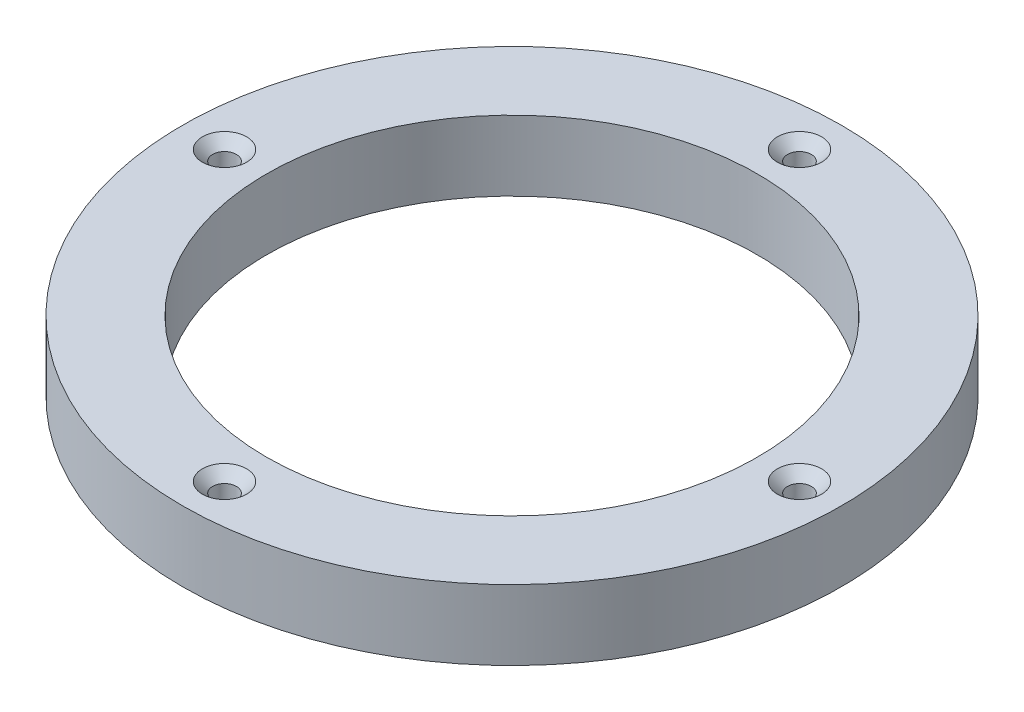
ISO-10303-21;
HEADER;
FILE_DESCRIPTION(('STEP AP214'),'2;1');
FILE_NAME('part.step','',(''),(''),'','','');
FILE_SCHEMA(('AUTOMOTIVE_DESIGN { 1 0 10303 214 1 1 1 1 }'));
ENDSEC;
DATA;
#1=APPLICATION_CONTEXT('core data for automotive mechanical design processes');
#2=APPLICATION_PROTOCOL_DEFINITION('international standard','automotive_design',2000,#1);
#3=PRODUCT_CONTEXT('',#1,'mechanical');
#4=PRODUCT('Part','Part','',(#3));
#5=PRODUCT_RELATED_PRODUCT_CATEGORY('part','',(#4));
#6=PRODUCT_DEFINITION_FORMATION('','',#4);
#7=PRODUCT_DEFINITION_CONTEXT('part definition',#1,'design');
#8=PRODUCT_DEFINITION('design','',#6,#7);
#9=PRODUCT_DEFINITION_SHAPE('','',#8);
#10=(LENGTH_UNIT() NAMED_UNIT(*) SI_UNIT(.MILLI.,.METRE.));
#11=(NAMED_UNIT(*) PLANE_ANGLE_UNIT() SI_UNIT($,.RADIAN.));
#12=(NAMED_UNIT(*) SI_UNIT($,.STERADIAN.) SOLID_ANGLE_UNIT());
#13=UNCERTAINTY_MEASURE_WITH_UNIT(LENGTH_MEASURE(1.E-05),#10,'distance_accuracy_value','');
#14=(GEOMETRIC_REPRESENTATION_CONTEXT(3) GLOBAL_UNCERTAINTY_ASSIGNED_CONTEXT((#13)) GLOBAL_UNIT_ASSIGNED_CONTEXT((#10,
#11,#12)) REPRESENTATION_CONTEXT('',''));
#15=CARTESIAN_POINT('',(0.,0.,0.));
#16=DIRECTION('',(0.,0.,1.));
#17=DIRECTION('',(1.,0.,0.));
#18=AXIS2_PLACEMENT_3D('',#15,#16,#17);
#19=CARTESIAN_POINT('',(0.,10.,0.));
#20=DIRECTION('',(0.,1.,0.));
#21=DIRECTION('',(0.,0.,1.));
#22=AXIS2_PLACEMENT_3D('',#19,#20,#21);
#23=PLANE('',#22);
#24=CARTESIAN_POINT('',(-41.,10.,0.));
#25=DIRECTION('',(0.,1.,0.));
#26=DIRECTION('',(0.,0.,1.));
#27=AXIS2_PLACEMENT_3D('',#24,#25,#26);
#28=CIRCLE('',#27,3.15);
#29=CARTESIAN_POINT('',(-41.,10.,3.15));
#30=VERTEX_POINT('',#29);
#31=EDGE_CURVE('E113',#30,#30,#28,.T.);
#32=ORIENTED_EDGE('',*,*,#31,.F.);
#33=EDGE_LOOP('',(#32));
#34=FACE_BOUND('',#33,.T.);
#35=CARTESIAN_POINT('',(41.,10.,0.));
#36=DIRECTION('',(0.,1.,0.));
#37=DIRECTION('',(0.,0.,1.));
#38=AXIS2_PLACEMENT_3D('',#35,#36,#37);
#39=CIRCLE('',#38,3.15);
#40=CARTESIAN_POINT('',(41.,10.,3.15));
#41=VERTEX_POINT('',#40);
#42=EDGE_CURVE('E70',#41,#41,#39,.T.);
#43=ORIENTED_EDGE('',*,*,#42,.F.);
#44=EDGE_LOOP('',(#43));
#45=FACE_BOUND('',#44,.T.);
#46=CARTESIAN_POINT('',(0.,10.,41.));
#47=DIRECTION('',(0.,1.,0.));
#48=DIRECTION('',(0.,0.,1.));
#49=AXIS2_PLACEMENT_3D('',#46,#47,#48);
#50=CIRCLE('',#49,3.15);
#51=CARTESIAN_POINT('',(0.,10.,44.15));
#52=VERTEX_POINT('',#51);
#53=EDGE_CURVE('E63',#52,#52,#50,.T.);
#54=ORIENTED_EDGE('',*,*,#53,.F.);
#55=EDGE_LOOP('',(#54));
#56=FACE_BOUND('',#55,.T.);
#57=CARTESIAN_POINT('',(0.,10.,-41.));
#58=DIRECTION('',(0.,1.,0.));
#59=DIRECTION('',(0.,0.,1.));
#60=AXIS2_PLACEMENT_3D('',#57,#58,#59);
#61=CIRCLE('',#60,3.15);
#62=CARTESIAN_POINT('',(0.,10.,-37.85));
#63=VERTEX_POINT('',#62);
#64=EDGE_CURVE('E59',#63,#63,#61,.T.);
#65=ORIENTED_EDGE('',*,*,#64,.F.);
#66=EDGE_LOOP('',(#65));
#67=FACE_BOUND('',#66,.T.);
#68=CARTESIAN_POINT('',(0.,10.,0.));
#69=DIRECTION('',(0.,1.,0.));
#70=DIRECTION('',(0.,0.,1.));
#71=AXIS2_PLACEMENT_3D('',#68,#69,#70);
#72=CIRCLE('',#71,47.);
#73=CARTESIAN_POINT('',(0.,10.,47.));
#74=VERTEX_POINT('',#73);
#75=EDGE_CURVE('E10',#74,#74,#72,.T.);
#76=ORIENTED_EDGE('',*,*,#75,.T.);
#77=EDGE_LOOP('',(#76));
#78=FACE_BOUND('',#77,.T.);
#79=CARTESIAN_POINT('',(0.,10.,0.));
#80=DIRECTION('',(0.,1.,0.));
#81=DIRECTION('',(0.,0.,1.));
#82=AXIS2_PLACEMENT_3D('',#79,#80,#81);
#83=CIRCLE('',#82,35.);
#84=CARTESIAN_POINT('',(0.,10.,35.));
#85=VERTEX_POINT('',#84);
#86=EDGE_CURVE('E47',#85,#85,#83,.T.);
#87=ORIENTED_EDGE('',*,*,#86,.F.);
#88=EDGE_LOOP('',(#87));
#89=FACE_BOUND('',#88,.T.);
#90=ADVANCED_FACE('F34',(#34,#45,#56,#67,#78,#89),#23,.T.);
#91=CARTESIAN_POINT('',(0.,0.,0.));
#92=DIRECTION('',(0.,1.,0.));
#93=DIRECTION('',(0.,0.,1.));
#94=AXIS2_PLACEMENT_3D('',#91,#92,#93);
#95=PLANE('',#94);
#96=CARTESIAN_POINT('',(-41.,0.,0.));
#97=DIRECTION('',(0.,1.,0.));
#98=DIRECTION('',(0.,0.,1.));
#99=AXIS2_PLACEMENT_3D('',#96,#97,#98);
#100=CIRCLE('',#99,1.69999999999997);
#101=CARTESIAN_POINT('',(-41.,0.,1.69999999999998));
#102=VERTEX_POINT('',#101);
#103=EDGE_CURVE('E38',#102,#102,#100,.T.);
#104=ORIENTED_EDGE('',*,*,#103,.T.);
#105=EDGE_LOOP('',(#104));
#106=FACE_BOUND('',#105,.T.);
#107=CARTESIAN_POINT('',(41.,0.,0.));
#108=DIRECTION('',(0.,1.,0.));
#109=DIRECTION('',(0.,0.,1.));
#110=AXIS2_PLACEMENT_3D('',#107,#108,#109);
#111=CIRCLE('',#110,1.69999999999997);
#112=CARTESIAN_POINT('',(41.,0.,1.69999999999997));
#113=VERTEX_POINT('',#112);
#114=EDGE_CURVE('E61',#113,#113,#111,.T.);
#115=ORIENTED_EDGE('',*,*,#114,.T.);
#116=EDGE_LOOP('',(#115));
#117=FACE_BOUND('',#116,.T.);
#118=CARTESIAN_POINT('',(0.,0.,41.));
#119=DIRECTION('',(0.,1.,0.));
#120=DIRECTION('',(0.,0.,1.));
#121=AXIS2_PLACEMENT_3D('',#118,#119,#120);
#122=CIRCLE('',#121,1.69999999999997);
#123=CARTESIAN_POINT('',(0.,0.,42.7));
#124=VERTEX_POINT('',#123);
#125=EDGE_CURVE('E57',#124,#124,#122,.T.);
#126=ORIENTED_EDGE('',*,*,#125,.T.);
#127=EDGE_LOOP('',(#126));
#128=FACE_BOUND('',#127,.T.);
#129=CARTESIAN_POINT('',(0.,0.,-41.));
#130=DIRECTION('',(0.,1.,0.));
#131=DIRECTION('',(0.,0.,1.));
#132=AXIS2_PLACEMENT_3D('',#129,#130,#131);
#133=CIRCLE('',#132,1.69999999999997);
#134=CARTESIAN_POINT('',(0.,0.,-39.3));
#135=VERTEX_POINT('',#134);
#136=EDGE_CURVE('E53',#135,#135,#133,.T.);
#137=ORIENTED_EDGE('',*,*,#136,.T.);
#138=EDGE_LOOP('',(#137));
#139=FACE_BOUND('',#138,.T.);
#140=CARTESIAN_POINT('',(0.,0.,0.));
#141=DIRECTION('',(0.,1.,0.));
#142=DIRECTION('',(0.,0.,1.));
#143=AXIS2_PLACEMENT_3D('',#140,#141,#142);
#144=CIRCLE('',#143,47.);
#145=CARTESIAN_POINT('',(0.,0.,47.));
#146=VERTEX_POINT('',#145);
#147=EDGE_CURVE('E42',#146,#146,#144,.T.);
#148=ORIENTED_EDGE('',*,*,#147,.F.);
#149=EDGE_LOOP('',(#148));
#150=FACE_BOUND('',#149,.T.);
#151=CARTESIAN_POINT('',(0.,0.,0.));
#152=DIRECTION('',(0.,1.,0.));
#153=DIRECTION('',(0.,0.,1.));
#154=AXIS2_PLACEMENT_3D('',#151,#152,#153);
#155=CIRCLE('',#154,35.);
#156=CARTESIAN_POINT('',(0.,0.,35.));
#157=VERTEX_POINT('',#156);
#158=EDGE_CURVE('E50',#157,#157,#155,.T.);
#159=ORIENTED_EDGE('',*,*,#158,.T.);
#160=EDGE_LOOP('',(#159));
#161=FACE_BOUND('',#160,.T.);
#162=ADVANCED_FACE('F89',(#106,#117,#128,#139,#150,#161),#95,.F.);
#163=CARTESIAN_POINT('',(0.,10.,0.));
#164=DIRECTION('',(0.,-1.,0.));
#165=DIRECTION('',(0.,0.,-1.));
#166=AXIS2_PLACEMENT_3D('',#163,#164,#165);
#167=CYLINDRICAL_SURFACE('',#166,47.);
#168=ORIENTED_EDGE('',*,*,#75,.F.);
#169=EDGE_LOOP('',(#168));
#170=FACE_BOUND('',#169,.T.);
#171=ORIENTED_EDGE('',*,*,#147,.T.);
#172=EDGE_LOOP('',(#171));
#173=FACE_BOUND('',#172,.T.);
#174=ADVANCED_FACE('F36',(#170,#173),#167,.T.);
#175=CARTESIAN_POINT('',(0.,10.,0.));
#176=DIRECTION('',(0.,-1.,0.));
#177=DIRECTION('',(0.,0.,-1.));
#178=AXIS2_PLACEMENT_3D('',#175,#176,#177);
#179=CYLINDRICAL_SURFACE('',#178,35.);
#180=ORIENTED_EDGE('',*,*,#86,.T.);
#181=EDGE_LOOP('',(#180));
#182=FACE_BOUND('',#181,.T.);
#183=ORIENTED_EDGE('',*,*,#158,.F.);
#184=EDGE_LOOP('',(#183));
#185=FACE_BOUND('',#184,.T.);
#186=ADVANCED_FACE('F91',(#182,#185),#179,.F.);
#187=CARTESIAN_POINT('',(0.,10.,-41.));
#188=DIRECTION('',(0.,1.,0.));
#189=DIRECTION('',(0.,0.,1.));
#190=AXIS2_PLACEMENT_3D('',#187,#188,#189);
#191=CYLINDRICAL_SURFACE('',#190,1.69999999999997);
#192=CARTESIAN_POINT('',(0.,8.54999999999999,-41.));
#193=DIRECTION('',(0.,1.,0.));
#194=DIRECTION('',(0.,0.,1.));
#195=AXIS2_PLACEMENT_3D('',#192,#193,#194);
#196=CIRCLE('',#195,1.69999999999998);
#197=CARTESIAN_POINT('',(0.,8.54999999999999,-39.3));
#198=VERTEX_POINT('',#197);
#199=EDGE_CURVE('E56',#198,#198,#196,.T.);
#200=ORIENTED_EDGE('',*,*,#199,.T.);
#201=EDGE_LOOP('',(#200));
#202=FACE_BOUND('',#201,.T.);
#203=ORIENTED_EDGE('',*,*,#136,.F.);
#204=EDGE_LOOP('',(#203));
#205=FACE_BOUND('',#204,.T.);
#206=ADVANCED_FACE('F93',(#202,#205),#191,.F.);
#207=CARTESIAN_POINT('',(0.,10.,-41.));
#208=DIRECTION('',(0.,1.,0.));
#209=DIRECTION('',(0.,0.,1.));
#210=AXIS2_PLACEMENT_3D('',#207,#208,#209);
#211=CONICAL_SURFACE('',#210,3.15,0.785398163397453);
#212=ORIENTED_EDGE('',*,*,#199,.F.);
#213=EDGE_LOOP('',(#212));
#214=FACE_BOUND('',#213,.T.);
#215=ORIENTED_EDGE('',*,*,#64,.T.);
#216=EDGE_LOOP('',(#215));
#217=FACE_BOUND('',#216,.T.);
#218=ADVANCED_FACE('F99',(#214,#217),#211,.F.);
#219=CARTESIAN_POINT('',(0.,10.,41.));
#220=DIRECTION('',(0.,1.,0.));
#221=DIRECTION('',(0.,0.,1.));
#222=AXIS2_PLACEMENT_3D('',#219,#220,#221);
#223=CYLINDRICAL_SURFACE('',#222,1.69999999999997);
#224=CARTESIAN_POINT('',(0.,8.54999999999999,41.));
#225=DIRECTION('',(0.,1.,0.));
#226=DIRECTION('',(0.,0.,1.));
#227=AXIS2_PLACEMENT_3D('',#224,#225,#226);
#228=CIRCLE('',#227,1.69999999999998);
#229=CARTESIAN_POINT('',(0.,8.54999999999999,42.7));
#230=VERTEX_POINT('',#229);
#231=EDGE_CURVE('E60',#230,#230,#228,.T.);
#232=ORIENTED_EDGE('',*,*,#231,.T.);
#233=EDGE_LOOP('',(#232));
#234=FACE_BOUND('',#233,.T.);
#235=ORIENTED_EDGE('',*,*,#125,.F.);
#236=EDGE_LOOP('',(#235));
#237=FACE_BOUND('',#236,.T.);
#238=ADVANCED_FACE('F122',(#234,#237),#223,.F.);
#239=CARTESIAN_POINT('',(0.,10.,41.));
#240=DIRECTION('',(0.,1.,0.));
#241=DIRECTION('',(0.,0.,1.));
#242=AXIS2_PLACEMENT_3D('',#239,#240,#241);
#243=CONICAL_SURFACE('',#242,3.15,0.785398163397453);
#244=ORIENTED_EDGE('',*,*,#231,.F.);
#245=EDGE_LOOP('',(#244));
#246=FACE_BOUND('',#245,.T.);
#247=ORIENTED_EDGE('',*,*,#53,.T.);
#248=EDGE_LOOP('',(#247));
#249=FACE_BOUND('',#248,.T.);
#250=ADVANCED_FACE('F128',(#246,#249),#243,.F.);
#251=CARTESIAN_POINT('',(41.,10.,0.));
#252=DIRECTION('',(0.,1.,0.));
#253=DIRECTION('',(0.,0.,1.));
#254=AXIS2_PLACEMENT_3D('',#251,#252,#253);
#255=CYLINDRICAL_SURFACE('',#254,1.69999999999997);
#256=CARTESIAN_POINT('',(41.,8.54999999999999,0.));
#257=DIRECTION('',(0.,1.,0.));
#258=DIRECTION('',(0.,0.,1.));
#259=AXIS2_PLACEMENT_3D('',#256,#257,#258);
#260=CIRCLE('',#259,1.69999999999998);
#261=CARTESIAN_POINT('',(41.,8.54999999999999,1.69999999999998));
#262=VERTEX_POINT('',#261);
#263=EDGE_CURVE('E64',#262,#262,#260,.T.);
#264=ORIENTED_EDGE('',*,*,#263,.T.);
#265=EDGE_LOOP('',(#264));
#266=FACE_BOUND('',#265,.T.);
#267=ORIENTED_EDGE('',*,*,#114,.F.);
#268=EDGE_LOOP('',(#267));
#269=FACE_BOUND('',#268,.T.);
#270=ADVANCED_FACE('F135',(#266,#269),#255,.F.);
#271=CARTESIAN_POINT('',(41.,10.,0.));
#272=DIRECTION('',(0.,1.,0.));
#273=DIRECTION('',(0.,0.,1.));
#274=AXIS2_PLACEMENT_3D('',#271,#272,#273);
#275=CONICAL_SURFACE('',#274,3.15,0.785398163397452);
#276=ORIENTED_EDGE('',*,*,#263,.F.);
#277=EDGE_LOOP('',(#276));
#278=FACE_BOUND('',#277,.T.);
#279=ORIENTED_EDGE('',*,*,#42,.T.);
#280=EDGE_LOOP('',(#279));
#281=FACE_BOUND('',#280,.T.);
#282=ADVANCED_FACE('F139',(#278,#281),#275,.F.);
#283=CARTESIAN_POINT('',(-41.,10.,0.));
#284=DIRECTION('',(0.,1.,0.));
#285=DIRECTION('',(0.,0.,1.));
#286=AXIS2_PLACEMENT_3D('',#283,#284,#285);
#287=CYLINDRICAL_SURFACE('',#286,1.69999999999997);
#288=CARTESIAN_POINT('',(-41.,8.54999999999999,0.));
#289=DIRECTION('',(0.,1.,0.));
#290=DIRECTION('',(0.,0.,1.));
#291=AXIS2_PLACEMENT_3D('',#288,#289,#290);
#292=CIRCLE('',#291,1.69999999999998);
#293=CARTESIAN_POINT('',(-41.,8.54999999999999,1.69999999999998));
#294=VERTEX_POINT('',#293);
#295=EDGE_CURVE('E155',#294,#294,#292,.T.);
#296=ORIENTED_EDGE('',*,*,#295,.T.);
#297=EDGE_LOOP('',(#296));
#298=FACE_BOUND('',#297,.T.);
#299=ORIENTED_EDGE('',*,*,#103,.F.);
#300=EDGE_LOOP('',(#299));
#301=FACE_BOUND('',#300,.T.);
#302=ADVANCED_FACE('F142',(#298,#301),#287,.F.);
#303=CARTESIAN_POINT('',(-41.,10.,0.));
#304=DIRECTION('',(0.,1.,0.));
#305=DIRECTION('',(0.,0.,1.));
#306=AXIS2_PLACEMENT_3D('',#303,#304,#305);
#307=CONICAL_SURFACE('',#306,3.15,0.785398163397452);
#308=ORIENTED_EDGE('',*,*,#295,.F.);
#309=EDGE_LOOP('',(#308));
#310=FACE_BOUND('',#309,.T.);
#311=ORIENTED_EDGE('',*,*,#31,.T.);
#312=EDGE_LOOP('',(#311));
#313=FACE_BOUND('',#312,.T.);
#314=ADVANCED_FACE('F146',(#310,#313),#307,.F.);
#315=CLOSED_SHELL('',(#90,#162,#174,#186,#206,#218,#238,#250,#270,#282,#302,#314));
#316=MANIFOLD_SOLID_BREP('B2',#315);
#317=ADVANCED_BREP_SHAPE_REPRESENTATION('',(#18,#316),#14);
#318=SHAPE_DEFINITION_REPRESENTATION(#9,#317);
ENDSEC;
END-ISO-10303-21;
